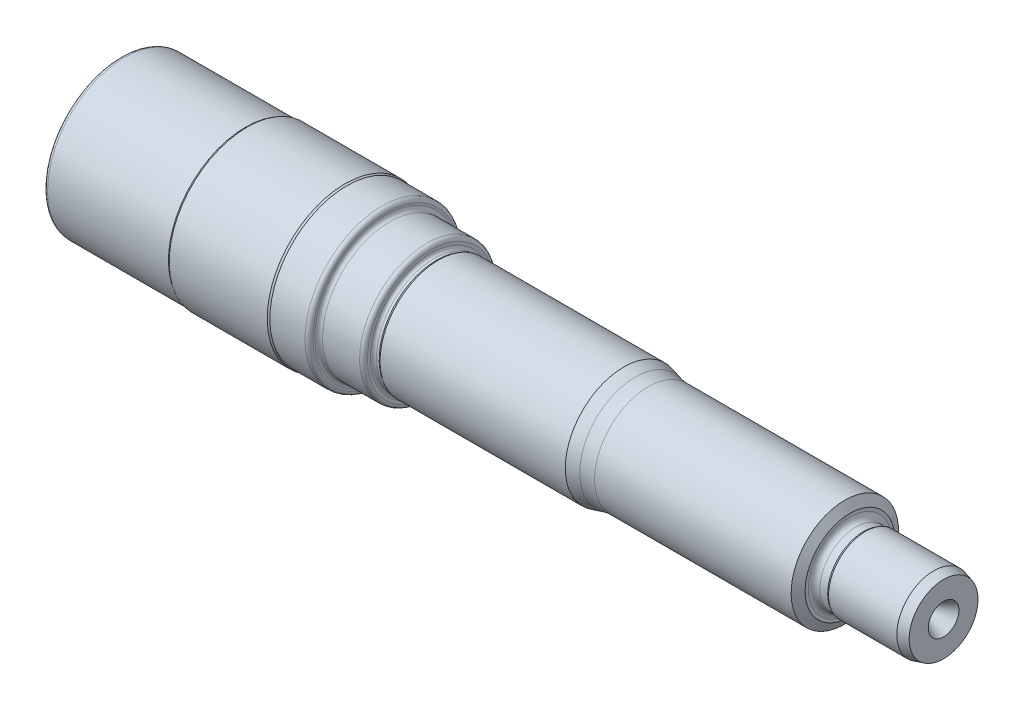
ISO-10303-21;
HEADER;
FILE_DESCRIPTION(('STEP AP214'),'2;1');
FILE_NAME('part.step','',(''),(''),'','','');
FILE_SCHEMA(('AUTOMOTIVE_DESIGN { 1 0 10303 214 1 1 1 1 }'));
ENDSEC;
DATA;
#1=APPLICATION_CONTEXT('core data for automotive mechanical design processes');
#2=APPLICATION_PROTOCOL_DEFINITION('international standard','automotive_design',2000,#1);
#3=PRODUCT_CONTEXT('',#1,'mechanical');
#4=PRODUCT('Part','Part','',(#3));
#5=PRODUCT_RELATED_PRODUCT_CATEGORY('part','',(#4));
#6=PRODUCT_DEFINITION_FORMATION('','',#4);
#7=PRODUCT_DEFINITION_CONTEXT('part definition',#1,'design');
#8=PRODUCT_DEFINITION('design','',#6,#7);
#9=PRODUCT_DEFINITION_SHAPE('','',#8);
#10=(LENGTH_UNIT() NAMED_UNIT(*) SI_UNIT(.MILLI.,.METRE.));
#11=(NAMED_UNIT(*) PLANE_ANGLE_UNIT() SI_UNIT($,.RADIAN.));
#12=(NAMED_UNIT(*) SI_UNIT($,.STERADIAN.) SOLID_ANGLE_UNIT());
#13=UNCERTAINTY_MEASURE_WITH_UNIT(LENGTH_MEASURE(1.E-05),#10,'distance_accuracy_value','');
#14=(GEOMETRIC_REPRESENTATION_CONTEXT(3) GLOBAL_UNCERTAINTY_ASSIGNED_CONTEXT((#13)) GLOBAL_UNIT_ASSIGNED_CONTEXT((#10,
#11,#12)) REPRESENTATION_CONTEXT('',''));
#15=CARTESIAN_POINT('',(0.,0.,0.));
#16=DIRECTION('',(0.,0.,1.));
#17=DIRECTION('',(1.,0.,0.));
#18=AXIS2_PLACEMENT_3D('',#15,#16,#17);
#19=CARTESIAN_POINT('',(32.4330127018922,0.,0.));
#20=DIRECTION('',(1.,0.,0.));
#21=DIRECTION('',(0.,1.,0.));
#22=AXIS2_PLACEMENT_3D('',#19,#20,#21);
#23=CONICAL_SURFACE('',#22,20.,0.523598775598297);
#24=CARTESIAN_POINT('',(32.,0.,0.));
#25=DIRECTION('',(1.,0.,0.));
#26=DIRECTION('',(0.,1.,0.));
#27=AXIS2_PLACEMENT_3D('',#24,#25,#26);
#28=CIRCLE('',#27,19.75);
#29=CARTESIAN_POINT('',(32.,19.75,0.));
#30=VERTEX_POINT('',#29);
#31=EDGE_CURVE('E13',#30,#30,#28,.T.);
#32=ORIENTED_EDGE('',*,*,#31,.T.);
#33=EDGE_LOOP('',(#32));
#34=FACE_BOUND('',#33,.T.);
#35=CARTESIAN_POINT('',(32.4330127018922,0.,0.));
#36=DIRECTION('',(1.,0.,0.));
#37=DIRECTION('',(0.,1.,0.));
#38=AXIS2_PLACEMENT_3D('',#35,#36,#37);
#39=CIRCLE('',#38,20.);
#40=CARTESIAN_POINT('',(32.4330127018922,20.,0.));
#41=VERTEX_POINT('',#40);
#42=EDGE_CURVE('E88',#41,#41,#39,.T.);
#43=ORIENTED_EDGE('',*,*,#42,.F.);
#44=EDGE_LOOP('',(#43));
#45=FACE_BOUND('',#44,.T.);
#46=ADVANCED_FACE('F49',(#34,#45),#23,.T.);
#47=CARTESIAN_POINT('',(204.,0.,0.));
#48=DIRECTION('',(1.,0.,0.));
#49=DIRECTION('',(0.,1.,0.));
#50=AXIS2_PLACEMENT_3D('',#47,#48,#49);
#51=CYLINDRICAL_SURFACE('',#50,19.75);
#52=CARTESIAN_POINT('',(1.,0.,0.));
#53=DIRECTION('',(1.,0.,0.));
#54=DIRECTION('',(0.,1.,0.));
#55=AXIS2_PLACEMENT_3D('',#52,#53,#54);
#56=CIRCLE('',#55,19.75);
#57=CARTESIAN_POINT('',(0.999999999999999,19.75,0.));
#58=VERTEX_POINT('',#57);
#59=EDGE_CURVE('E55',#58,#58,#56,.T.);
#60=ORIENTED_EDGE('',*,*,#59,.T.);
#61=EDGE_LOOP('',(#60));
#62=FACE_BOUND('',#61,.T.);
#63=ORIENTED_EDGE('',*,*,#31,.F.);
#64=EDGE_LOOP('',(#63));
#65=FACE_BOUND('',#64,.T.);
#66=ADVANCED_FACE('F76',(#62,#65),#51,.T.);
#67=CARTESIAN_POINT('',(1.,0.,0.));
#68=DIRECTION('',(1.,0.,0.));
#69=DIRECTION('',(0.,1.,0.));
#70=AXIS2_PLACEMENT_3D('',#67,#68,#69);
#71=TOROIDAL_SURFACE('',#70,18.75,1.);
#72=CARTESIAN_POINT('',(0.,0.,0.));
#73=DIRECTION('',(1.,0.,0.));
#74=DIRECTION('',(0.,1.,0.));
#75=AXIS2_PLACEMENT_3D('',#72,#73,#74);
#76=CIRCLE('',#75,18.75);
#77=CARTESIAN_POINT('',(0.,18.75,0.));
#78=VERTEX_POINT('',#77);
#79=EDGE_CURVE('E193',#78,#78,#76,.T.);
#80=ORIENTED_EDGE('',*,*,#79,.T.);
#81=EDGE_LOOP('',(#80));
#82=FACE_BOUND('',#81,.T.);
#83=ORIENTED_EDGE('',*,*,#59,.F.);
#84=EDGE_LOOP('',(#83));
#85=FACE_BOUND('',#84,.T.);
#86=ADVANCED_FACE('F82',(#82,#85),#71,.T.);
#87=CARTESIAN_POINT('',(0.,15.8660254037844,0.));
#88=DIRECTION('',(-1.,0.,0.));
#89=DIRECTION('',(0.,-1.,0.));
#90=AXIS2_PLACEMENT_3D('',#87,#88,#89);
#91=PLANE('',#90);
#92=CARTESIAN_POINT('',(0.,0.,0.));
#93=DIRECTION('',(1.,0.,0.));
#94=DIRECTION('',(0.,1.,0.));
#95=AXIS2_PLACEMENT_3D('',#92,#93,#94);
#96=CIRCLE('',#95,15.8660254037844);
#97=CARTESIAN_POINT('',(0.,15.8660254037844,0.));
#98=VERTEX_POINT('',#97);
#99=EDGE_CURVE('E190',#98,#98,#96,.T.);
#100=ORIENTED_EDGE('',*,*,#99,.T.);
#101=EDGE_LOOP('',(#100));
#102=FACE_BOUND('',#101,.T.);
#103=ORIENTED_EDGE('',*,*,#79,.F.);
#104=EDGE_LOOP('',(#103));
#105=FACE_BOUND('',#104,.T.);
#106=ADVANCED_FACE('F200',(#102,#105),#91,.T.);
#107=CARTESIAN_POINT('',(0.,0.,0.));
#108=DIRECTION('',(-1.,0.,0.));
#109=DIRECTION('',(0.,-1.,0.));
#110=AXIS2_PLACEMENT_3D('',#107,#108,#109);
#111=CONICAL_SURFACE('',#110,15.8660254037844,0.52359877559829);
#112=CARTESIAN_POINT('',(1.5,0.,0.));
#113=DIRECTION('',(1.,0.,0.));
#114=DIRECTION('',(0.,1.,0.));
#115=AXIS2_PLACEMENT_3D('',#112,#113,#114);
#116=CIRCLE('',#115,15.);
#117=CARTESIAN_POINT('',(1.5,15.,0.));
#118=VERTEX_POINT('',#117);
#119=EDGE_CURVE('E187',#118,#118,#116,.T.);
#120=ORIENTED_EDGE('',*,*,#119,.T.);
#121=EDGE_LOOP('',(#120));
#122=FACE_BOUND('',#121,.T.);
#123=ORIENTED_EDGE('',*,*,#99,.F.);
#124=EDGE_LOOP('',(#123));
#125=FACE_BOUND('',#124,.T.);
#126=ADVANCED_FACE('F206',(#122,#125),#111,.F.);
#127=CARTESIAN_POINT('',(204.,0.,0.));
#128=DIRECTION('',(1.,0.,0.));
#129=DIRECTION('',(0.,1.,0.));
#130=AXIS2_PLACEMENT_3D('',#127,#128,#129);
#131=CYLINDRICAL_SURFACE('',#130,15.);
#132=CARTESIAN_POINT('',(4.,0.,0.));
#133=DIRECTION('',(1.,0.,0.));
#134=DIRECTION('',(0.,1.,0.));
#135=AXIS2_PLACEMENT_3D('',#132,#133,#134);
#136=CIRCLE('',#135,15.);
#137=CARTESIAN_POINT('',(4.,15.,0.));
#138=VERTEX_POINT('',#137);
#139=EDGE_CURVE('E184',#138,#138,#136,.T.);
#140=ORIENTED_EDGE('',*,*,#139,.T.);
#141=EDGE_LOOP('',(#140));
#142=FACE_BOUND('',#141,.T.);
#143=ORIENTED_EDGE('',*,*,#119,.F.);
#144=EDGE_LOOP('',(#143));
#145=FACE_BOUND('',#144,.T.);
#146=ADVANCED_FACE('F212',(#142,#145),#131,.F.);
#147=CARTESIAN_POINT('',(4.,0.,0.));
#148=DIRECTION('',(-1.,0.,0.));
#149=DIRECTION('',(0.,-1.,0.));
#150=AXIS2_PLACEMENT_3D('',#147,#148,#149);
#151=CONICAL_SURFACE('',#150,15.,0.78539816339745);
#152=CARTESIAN_POINT('',(7.19999999999998,0.,0.));
#153=DIRECTION('',(1.,0.,0.));
#154=DIRECTION('',(0.,1.,0.));
#155=AXIS2_PLACEMENT_3D('',#152,#153,#154);
#156=CIRCLE('',#155,11.8);
#157=CARTESIAN_POINT('',(7.19999999999998,11.8,0.));
#158=VERTEX_POINT('',#157);
#159=EDGE_CURVE('E181',#158,#158,#156,.T.);
#160=ORIENTED_EDGE('',*,*,#159,.T.);
#161=EDGE_LOOP('',(#160));
#162=FACE_BOUND('',#161,.T.);
#163=ORIENTED_EDGE('',*,*,#139,.F.);
#164=EDGE_LOOP('',(#163));
#165=FACE_BOUND('',#164,.T.);
#166=ADVANCED_FACE('F216',(#162,#165),#151,.F.);
#167=CARTESIAN_POINT('',(204.,0.,0.));
#168=DIRECTION('',(1.,0.,0.));
#169=DIRECTION('',(0.,1.,0.));
#170=AXIS2_PLACEMENT_3D('',#167,#168,#169);
#171=CYLINDRICAL_SURFACE('',#170,11.8);
#172=CARTESIAN_POINT('',(50.,0.,0.));
#173=DIRECTION('',(1.,0.,0.));
#174=DIRECTION('',(0.,1.,0.));
#175=AXIS2_PLACEMENT_3D('',#172,#173,#174);
#176=CIRCLE('',#175,11.8);
#177=CARTESIAN_POINT('',(50.,11.8,0.));
#178=VERTEX_POINT('',#177);
#179=EDGE_CURVE('E178',#178,#178,#176,.T.);
#180=ORIENTED_EDGE('',*,*,#179,.T.);
#181=EDGE_LOOP('',(#180));
#182=FACE_BOUND('',#181,.T.);
#183=ORIENTED_EDGE('',*,*,#159,.F.);
#184=EDGE_LOOP('',(#183));
#185=FACE_BOUND('',#184,.T.);
#186=ADVANCED_FACE('F220',(#182,#185),#171,.F.);
#187=CARTESIAN_POINT('',(50.,0.,0.));
#188=DIRECTION('',(1.,0.,0.));
#189=DIRECTION('',(0.,1.,0.));
#190=AXIS2_PLACEMENT_3D('',#187,#188,#189);
#191=CONICAL_SURFACE('',#190,11.8,0.47123889803847);
#192=CARTESIAN_POINT('',(55.2990483648639,0.,0.));
#193=DIRECTION('',(1.,0.,0.));
#194=DIRECTION('',(0.,1.,0.));
#195=AXIS2_PLACEMENT_3D('',#192,#193,#194);
#196=CIRCLE('',#195,14.5);
#197=CARTESIAN_POINT('',(55.2990483648639,14.5,0.));
#198=VERTEX_POINT('',#197);
#199=EDGE_CURVE('E175',#198,#198,#196,.T.);
#200=ORIENTED_EDGE('',*,*,#199,.T.);
#201=EDGE_LOOP('',(#200));
#202=FACE_BOUND('',#201,.T.);
#203=ORIENTED_EDGE('',*,*,#179,.F.);
#204=EDGE_LOOP('',(#203));
#205=FACE_BOUND('',#204,.T.);
#206=ADVANCED_FACE('F224',(#202,#205),#191,.F.);
#207=CARTESIAN_POINT('',(204.,0.,0.));
#208=DIRECTION('',(1.,0.,0.));
#209=DIRECTION('',(0.,1.,0.));
#210=AXIS2_PLACEMENT_3D('',#207,#208,#209);
#211=CYLINDRICAL_SURFACE('',#210,14.5);
#212=CARTESIAN_POINT('',(61.,0.,0.));
#213=DIRECTION('',(1.,0.,0.));
#214=DIRECTION('',(0.,1.,0.));
#215=AXIS2_PLACEMENT_3D('',#212,#213,#214);
#216=CIRCLE('',#215,14.5);
#217=CARTESIAN_POINT('',(61.,14.5,0.));
#218=VERTEX_POINT('',#217);
#219=EDGE_CURVE('E172',#218,#218,#216,.T.);
#220=ORIENTED_EDGE('',*,*,#219,.T.);
#221=EDGE_LOOP('',(#220));
#222=FACE_BOUND('',#221,.T.);
#223=ORIENTED_EDGE('',*,*,#199,.F.);
#224=EDGE_LOOP('',(#223));
#225=FACE_BOUND('',#224,.T.);
#226=ADVANCED_FACE('F228',(#222,#225),#211,.F.);
#227=CARTESIAN_POINT('',(61.,0.,0.));
#228=DIRECTION('',(1.,0.,0.));
#229=DIRECTION('',(0.,1.,0.));
#230=AXIS2_PLACEMENT_3D('',#227,#228,#229);
#231=TOROIDAL_SURFACE('',#230,12.5,2.);
#232=CARTESIAN_POINT('',(63.,0.,0.));
#233=DIRECTION('',(1.,0.,0.));
#234=DIRECTION('',(0.,1.,0.));
#235=AXIS2_PLACEMENT_3D('',#232,#233,#234);
#236=CIRCLE('',#235,12.5);
#237=CARTESIAN_POINT('',(63.,12.5,0.));
#238=VERTEX_POINT('',#237);
#239=EDGE_CURVE('E169',#238,#238,#236,.T.);
#240=ORIENTED_EDGE('',*,*,#239,.T.);
#241=EDGE_LOOP('',(#240));
#242=FACE_BOUND('',#241,.T.);
#243=ORIENTED_EDGE('',*,*,#219,.F.);
#244=EDGE_LOOP('',(#243));
#245=FACE_BOUND('',#244,.T.);
#246=ADVANCED_FACE('F71',(#242,#245),#231,.F.);
#247=CARTESIAN_POINT('',(63.,0.,0.));
#248=DIRECTION('',(-1.,0.,0.));
#249=DIRECTION('',(0.,-1.,0.));
#250=AXIS2_PLACEMENT_3D('',#247,#248,#249);
#251=PLANE('',#250);
#252=ORIENTED_EDGE('',*,*,#239,.F.);
#253=EDGE_LOOP('',(#252));
#254=FACE_BOUND('',#253,.T.);
#255=ADVANCED_FACE('F61',(#254),#251,.T.);
#256=CARTESIAN_POINT('',(204.,0.,0.));
#257=DIRECTION('',(1.,0.,0.));
#258=DIRECTION('',(0.,1.,0.));
#259=AXIS2_PLACEMENT_3D('',#256,#257,#258);
#260=CONICAL_SURFACE('',#259,0.,1.04719755119659);
#261=CARTESIAN_POINT('',(204.909326673974,0.,0.));
#262=DIRECTION('',(1.,0.,0.));
#263=DIRECTION('',(0.,1.,0.));
#264=AXIS2_PLACEMENT_3D('',#261,#262,#263);
#265=CIRCLE('',#264,1.575);
#266=CARTESIAN_POINT('',(204.909326673974,1.575,0.));
#267=VERTEX_POINT('',#266);
#268=EDGE_CURVE('E167',#267,#267,#265,.T.);
#269=ORIENTED_EDGE('',*,*,#268,.T.);
#270=EDGE_LOOP('',(#269));
#271=FACE_BOUND('',#270,.T.);
#272=CARTESIAN_POINT('',(204.,0.,0.));
#273=VERTEX_POINT('',#272);
#274=VERTEX_LOOP('',#273);
#275=FACE_BOUND('',#274,.T.);
#276=ADVANCED_FACE('F58',(#271,#275),#260,.F.);
#277=CARTESIAN_POINT('',(204.,0.,0.));
#278=DIRECTION('',(1.,0.,0.));
#279=DIRECTION('',(0.,1.,0.));
#280=AXIS2_PLACEMENT_3D('',#277,#278,#279);
#281=CYLINDRICAL_SURFACE('',#280,1.575);
#282=CARTESIAN_POINT('',(206.909326673974,0.,0.));
#283=DIRECTION('',(1.,0.,0.));
#284=DIRECTION('',(0.,1.,0.));
#285=AXIS2_PLACEMENT_3D('',#282,#283,#284);
#286=CIRCLE('',#285,1.575);
#287=CARTESIAN_POINT('',(206.909326673974,1.575,0.));
#288=VERTEX_POINT('',#287);
#289=EDGE_CURVE('E164',#288,#288,#286,.T.);
#290=ORIENTED_EDGE('',*,*,#289,.T.);
#291=EDGE_LOOP('',(#290));
#292=FACE_BOUND('',#291,.T.);
#293=ORIENTED_EDGE('',*,*,#268,.F.);
#294=EDGE_LOOP('',(#293));
#295=FACE_BOUND('',#294,.T.);
#296=ADVANCED_FACE('F60',(#292,#295),#281,.F.);
#297=CARTESIAN_POINT('',(206.909326673974,0.,0.));
#298=DIRECTION('',(1.,0.,0.));
#299=DIRECTION('',(0.,1.,0.));
#300=AXIS2_PLACEMENT_3D('',#297,#298,#299);
#301=CONICAL_SURFACE('',#300,1.575,0.523598775598298);
#302=CARTESIAN_POINT('',(211.,0.,0.));
#303=DIRECTION('',(1.,0.,0.));
#304=DIRECTION('',(0.,1.,0.));
#305=AXIS2_PLACEMENT_3D('',#302,#303,#304);
#306=CIRCLE('',#305,3.93675134594813);
#307=CARTESIAN_POINT('',(211.,3.93675134594812,0.));
#308=VERTEX_POINT('',#307);
#309=EDGE_CURVE('E161',#308,#308,#306,.T.);
#310=ORIENTED_EDGE('',*,*,#309,.T.);
#311=EDGE_LOOP('',(#310));
#312=FACE_BOUND('',#311,.T.);
#313=ORIENTED_EDGE('',*,*,#289,.F.);
#314=EDGE_LOOP('',(#313));
#315=FACE_BOUND('',#314,.T.);
#316=ADVANCED_FACE('F68',(#312,#315),#301,.F.);
#317=CARTESIAN_POINT('',(211.,8.83012701892219,0.));
#318=DIRECTION('',(1.,0.,0.));
#319=DIRECTION('',(0.,1.,0.));
#320=AXIS2_PLACEMENT_3D('',#317,#318,#319);
#321=PLANE('',#320);
#322=CARTESIAN_POINT('',(211.,0.,0.));
#323=DIRECTION('',(1.,0.,0.));
#324=DIRECTION('',(0.,1.,0.));
#325=AXIS2_PLACEMENT_3D('',#322,#323,#324);
#326=CIRCLE('',#325,8.83012701892219);
#327=CARTESIAN_POINT('',(211.,8.83012701892219,0.));
#328=VERTEX_POINT('',#327);
#329=EDGE_CURVE('E158',#328,#328,#326,.T.);
#330=ORIENTED_EDGE('',*,*,#329,.T.);
#331=EDGE_LOOP('',(#330));
#332=FACE_BOUND('',#331,.T.);
#333=ORIENTED_EDGE('',*,*,#309,.F.);
#334=EDGE_LOOP('',(#333));
#335=FACE_BOUND('',#334,.T.);
#336=ADVANCED_FACE('F280',(#332,#335),#321,.T.);
#337=CARTESIAN_POINT('',(211.,0.,0.));
#338=DIRECTION('',(-1.,0.,0.));
#339=DIRECTION('',(0.,-1.,0.));
#340=AXIS2_PLACEMENT_3D('',#337,#338,#339);
#341=CONICAL_SURFACE('',#340,8.83012701892219,0.26179938779915);
#342=CARTESIAN_POINT('',(208.5,0.,0.));
#343=DIRECTION('',(1.,0.,0.));
#344=DIRECTION('',(0.,1.,0.));
#345=AXIS2_PLACEMENT_3D('',#342,#343,#344);
#346=CIRCLE('',#345,9.5);
#347=CARTESIAN_POINT('',(208.5,9.49999999999999,0.));
#348=VERTEX_POINT('',#347);
#349=EDGE_CURVE('E155',#348,#348,#346,.T.);
#350=ORIENTED_EDGE('',*,*,#349,.T.);
#351=EDGE_LOOP('',(#350));
#352=FACE_BOUND('',#351,.T.);
#353=ORIENTED_EDGE('',*,*,#329,.F.);
#354=EDGE_LOOP('',(#353));
#355=FACE_BOUND('',#354,.T.);
#356=ADVANCED_FACE('F291',(#352,#355),#341,.T.);
#357=CARTESIAN_POINT('',(204.,0.,0.));
#358=DIRECTION('',(1.,0.,0.));
#359=DIRECTION('',(0.,1.,0.));
#360=AXIS2_PLACEMENT_3D('',#357,#358,#359);
#361=CYLINDRICAL_SURFACE('',#360,9.5);
#362=CARTESIAN_POINT('',(191.,0.,0.));
#363=DIRECTION('',(1.,0.,0.));
#364=DIRECTION('',(0.,1.,0.));
#365=AXIS2_PLACEMENT_3D('',#362,#363,#364);
#366=CIRCLE('',#365,9.5);
#367=CARTESIAN_POINT('',(191.,9.49999999999999,0.));
#368=VERTEX_POINT('',#367);
#369=EDGE_CURVE('E152',#368,#368,#366,.T.);
#370=ORIENTED_EDGE('',*,*,#369,.T.);
#371=EDGE_LOOP('',(#370));
#372=FACE_BOUND('',#371,.T.);
#373=ORIENTED_EDGE('',*,*,#349,.F.);
#374=EDGE_LOOP('',(#373));
#375=FACE_BOUND('',#374,.T.);
#376=ADVANCED_FACE('F302',(#372,#375),#361,.T.);
#377=CARTESIAN_POINT('',(191.,0.,0.));
#378=DIRECTION('',(1.,0.,0.));
#379=DIRECTION('',(0.,1.,0.));
#380=AXIS2_PLACEMENT_3D('',#377,#378,#379);
#381=CONICAL_SURFACE('',#380,9.5,0.523598775598306);
#382=CARTESIAN_POINT('',(190.480384757729,0.,0.));
#383=DIRECTION('',(1.,0.,0.));
#384=DIRECTION('',(0.,1.,0.));
#385=AXIS2_PLACEMENT_3D('',#382,#383,#384);
#386=CIRCLE('',#385,9.2);
#387=CARTESIAN_POINT('',(190.480384757729,9.2,0.));
#388=VERTEX_POINT('',#387);
#389=EDGE_CURVE('E149',#388,#388,#386,.T.);
#390=ORIENTED_EDGE('',*,*,#389,.T.);
#391=EDGE_LOOP('',(#390));
#392=FACE_BOUND('',#391,.T.);
#393=ORIENTED_EDGE('',*,*,#369,.F.);
#394=EDGE_LOOP('',(#393));
#395=FACE_BOUND('',#394,.T.);
#396=ADVANCED_FACE('F312',(#392,#395),#381,.T.);
#397=CARTESIAN_POINT('',(204.,0.,0.));
#398=DIRECTION('',(1.,0.,0.));
#399=DIRECTION('',(0.,1.,0.));
#400=AXIS2_PLACEMENT_3D('',#397,#398,#399);
#401=CYLINDRICAL_SURFACE('',#400,9.2);
#402=CARTESIAN_POINT('',(188.5,0.,0.));
#403=DIRECTION('',(1.,0.,0.));
#404=DIRECTION('',(0.,1.,0.));
#405=AXIS2_PLACEMENT_3D('',#402,#403,#404);
#406=CIRCLE('',#405,9.2);
#407=CARTESIAN_POINT('',(188.5,9.2,0.));
#408=VERTEX_POINT('',#407);
#409=EDGE_CURVE('E146',#408,#408,#406,.T.);
#410=ORIENTED_EDGE('',*,*,#409,.T.);
#411=EDGE_LOOP('',(#410));
#412=FACE_BOUND('',#411,.T.);
#413=ORIENTED_EDGE('',*,*,#389,.F.);
#414=EDGE_LOOP('',(#413));
#415=FACE_BOUND('',#414,.T.);
#416=ADVANCED_FACE('F322',(#412,#415),#401,.T.);
#417=CARTESIAN_POINT('',(188.5,0.,0.));
#418=DIRECTION('',(1.,0.,0.));
#419=DIRECTION('',(0.,1.,0.));
#420=AXIS2_PLACEMENT_3D('',#417,#418,#419);
#421=TOROIDAL_SURFACE('',#420,10.7,1.5);
#422=CARTESIAN_POINT('',(187.,0.,0.));
#423=DIRECTION('',(1.,0.,0.));
#424=DIRECTION('',(0.,1.,0.));
#425=AXIS2_PLACEMENT_3D('',#422,#423,#424);
#426=CIRCLE('',#425,10.7);
#427=CARTESIAN_POINT('',(187.,10.7,0.));
#428=VERTEX_POINT('',#427);
#429=EDGE_CURVE('E143',#428,#428,#426,.T.);
#430=ORIENTED_EDGE('',*,*,#429,.T.);
#431=EDGE_LOOP('',(#430));
#432=FACE_BOUND('',#431,.T.);
#433=ORIENTED_EDGE('',*,*,#409,.F.);
#434=EDGE_LOOP('',(#433));
#435=FACE_BOUND('',#434,.T.);
#436=ADVANCED_FACE('F333',(#432,#435),#421,.F.);
#437=CARTESIAN_POINT('',(187.,11.5,0.));
#438=DIRECTION('',(1.,0.,0.));
#439=DIRECTION('',(0.,1.,0.));
#440=AXIS2_PLACEMENT_3D('',#437,#438,#439);
#441=PLANE('',#440);
#442=CARTESIAN_POINT('',(187.,0.,0.));
#443=DIRECTION('',(1.,0.,0.));
#444=DIRECTION('',(0.,1.,0.));
#445=AXIS2_PLACEMENT_3D('',#442,#443,#444);
#446=CIRCLE('',#445,11.5);
#447=CARTESIAN_POINT('',(187.,11.5,0.));
#448=VERTEX_POINT('',#447);
#449=EDGE_CURVE('E140',#448,#448,#446,.T.);
#450=ORIENTED_EDGE('',*,*,#449,.T.);
#451=EDGE_LOOP('',(#450));
#452=FACE_BOUND('',#451,.T.);
#453=ORIENTED_EDGE('',*,*,#429,.F.);
#454=EDGE_LOOP('',(#453));
#455=FACE_BOUND('',#454,.T.);
#456=ADVANCED_FACE('F344',(#452,#455),#441,.T.);
#457=CARTESIAN_POINT('',(187.,0.,0.));
#458=DIRECTION('',(-1.,0.,0.));
#459=DIRECTION('',(0.,-1.,0.));
#460=AXIS2_PLACEMENT_3D('',#457,#458,#459);
#461=CONICAL_SURFACE('',#460,11.5,1.04719755119659);
#462=CARTESIAN_POINT('',(185.686528137594,0.,0.));
#463=DIRECTION('',(1.,0.,0.));
#464=DIRECTION('',(0.,1.,0.));
#465=AXIS2_PLACEMENT_3D('',#462,#463,#464);
#466=CIRCLE('',#465,13.775);
#467=CARTESIAN_POINT('',(185.686528137594,13.775,0.));
#468=VERTEX_POINT('',#467);
#469=EDGE_CURVE('E137',#468,#468,#466,.T.);
#470=ORIENTED_EDGE('',*,*,#469,.T.);
#471=EDGE_LOOP('',(#470));
#472=FACE_BOUND('',#471,.T.);
#473=ORIENTED_EDGE('',*,*,#449,.F.);
#474=EDGE_LOOP('',(#473));
#475=FACE_BOUND('',#474,.T.);
#476=ADVANCED_FACE('F355',(#472,#475),#461,.T.);
#477=CARTESIAN_POINT('',(204.,0.,0.));
#478=DIRECTION('',(1.,0.,0.));
#479=DIRECTION('',(0.,1.,0.));
#480=AXIS2_PLACEMENT_3D('',#477,#478,#479);
#481=CYLINDRICAL_SURFACE('',#480,13.775);
#482=CARTESIAN_POINT('',(135.283244707908,0.,0.));
#483=DIRECTION('',(1.,0.,0.));
#484=DIRECTION('',(0.,1.,0.));
#485=AXIS2_PLACEMENT_3D('',#482,#483,#484);
#486=CIRCLE('',#485,13.775);
#487=CARTESIAN_POINT('',(135.283244707908,13.775,0.));
#488=VERTEX_POINT('',#487);
#489=EDGE_CURVE('E134',#488,#488,#486,.T.);
#490=ORIENTED_EDGE('',*,*,#489,.T.);
#491=EDGE_LOOP('',(#490));
#492=FACE_BOUND('',#491,.T.);
#493=ORIENTED_EDGE('',*,*,#469,.F.);
#494=EDGE_LOOP('',(#493));
#495=FACE_BOUND('',#494,.T.);
#496=ADVANCED_FACE('F366',(#492,#495),#481,.T.);
#497=CARTESIAN_POINT('',(135.283244707908,0.,0.));
#498=DIRECTION('',(1.,0.,0.));
#499=DIRECTION('',(0.,1.,0.));
#500=AXIS2_PLACEMENT_3D('',#497,#498,#499);
#501=TOROIDAL_SURFACE('',#500,26.775,13.);
#502=CARTESIAN_POINT('',(131.918597121575,0.,0.));
#503=DIRECTION('',(1.,0.,0.));
#504=DIRECTION('',(0.,1.,0.));
#505=AXIS2_PLACEMENT_3D('',#502,#503,#504);
#506=CIRCLE('',#505,14.2179642582421);
#507=CARTESIAN_POINT('',(131.918597121575,14.2179642582421,0.));
#508=VERTEX_POINT('',#507);
#509=EDGE_CURVE('E131',#508,#508,#506,.T.);
#510=ORIENTED_EDGE('',*,*,#509,.T.);
#511=EDGE_LOOP('',(#510));
#512=FACE_BOUND('',#511,.T.);
#513=ORIENTED_EDGE('',*,*,#489,.F.);
#514=EDGE_LOOP('',(#513));
#515=FACE_BOUND('',#514,.T.);
#516=ADVANCED_FACE('F377',(#512,#515),#501,.F.);
#517=CARTESIAN_POINT('',(131.918597121575,0.,0.));
#518=DIRECTION('',(-1.,0.,0.));
#519=DIRECTION('',(0.,-1.,0.));
#520=AXIS2_PLACEMENT_3D('',#517,#518,#519);
#521=CONICAL_SURFACE('',#520,14.2179642582421,0.261799387799143);
#522=CARTESIAN_POINT('',(129.,0.,0.));
#523=DIRECTION('',(1.,0.,0.));
#524=DIRECTION('',(0.,1.,0.));
#525=AXIS2_PLACEMENT_3D('',#522,#523,#524);
#526=CIRCLE('',#525,15.);
#527=CARTESIAN_POINT('',(129.,15.,0.));
#528=VERTEX_POINT('',#527);
#529=EDGE_CURVE('E128',#528,#528,#526,.T.);
#530=ORIENTED_EDGE('',*,*,#529,.T.);
#531=EDGE_LOOP('',(#530));
#532=FACE_BOUND('',#531,.T.);
#533=ORIENTED_EDGE('',*,*,#509,.F.);
#534=EDGE_LOOP('',(#533));
#535=FACE_BOUND('',#534,.T.);
#536=ADVANCED_FACE('F388',(#532,#535),#521,.T.);
#537=CARTESIAN_POINT('',(204.,0.,0.));
#538=DIRECTION('',(1.,0.,0.));
#539=DIRECTION('',(0.,1.,0.));
#540=AXIS2_PLACEMENT_3D('',#537,#538,#539);
#541=CYLINDRICAL_SURFACE('',#540,15.);
#542=CARTESIAN_POINT('',(81.5,0.,0.));
#543=DIRECTION('',(1.,0.,0.));
#544=DIRECTION('',(0.,1.,0.));
#545=AXIS2_PLACEMENT_3D('',#542,#543,#544);
#546=CIRCLE('',#545,15.);
#547=CARTESIAN_POINT('',(81.5,15.,0.));
#548=VERTEX_POINT('',#547);
#549=EDGE_CURVE('E125',#548,#548,#546,.T.);
#550=ORIENTED_EDGE('',*,*,#549,.T.);
#551=EDGE_LOOP('',(#550));
#552=FACE_BOUND('',#551,.T.);
#553=ORIENTED_EDGE('',*,*,#529,.F.);
#554=EDGE_LOOP('',(#553));
#555=FACE_BOUND('',#554,.T.);
#556=ADVANCED_FACE('F398',(#552,#555),#541,.T.);
#557=CARTESIAN_POINT('',(81.5,0.,0.));
#558=DIRECTION('',(1.,0.,0.));
#559=DIRECTION('',(0.,1.,0.));
#560=AXIS2_PLACEMENT_3D('',#557,#558,#559);
#561=CONICAL_SURFACE('',#560,15.,0.523598775598301);
#562=CARTESIAN_POINT('',(80.9803847577293,0.,0.));
#563=DIRECTION('',(1.,0.,0.));
#564=DIRECTION('',(0.,1.,0.));
#565=AXIS2_PLACEMENT_3D('',#562,#563,#564);
#566=CIRCLE('',#565,14.7);
#567=CARTESIAN_POINT('',(80.9803847577293,14.7,0.));
#568=VERTEX_POINT('',#567);
#569=EDGE_CURVE('E122',#568,#568,#566,.T.);
#570=ORIENTED_EDGE('',*,*,#569,.T.);
#571=EDGE_LOOP('',(#570));
#572=FACE_BOUND('',#571,.T.);
#573=ORIENTED_EDGE('',*,*,#549,.F.);
#574=EDGE_LOOP('',(#573));
#575=FACE_BOUND('',#574,.T.);
#576=ADVANCED_FACE('F408',(#572,#575),#561,.T.);
#577=CARTESIAN_POINT('',(204.,0.,0.));
#578=DIRECTION('',(1.,0.,0.));
#579=DIRECTION('',(0.,1.,0.));
#580=AXIS2_PLACEMENT_3D('',#577,#578,#579);
#581=CYLINDRICAL_SURFACE('',#580,14.7);
#582=CARTESIAN_POINT('',(80.3,0.,0.));
#583=DIRECTION('',(1.,0.,0.));
#584=DIRECTION('',(0.,1.,0.));
#585=AXIS2_PLACEMENT_3D('',#582,#583,#584);
#586=CIRCLE('',#585,14.7);
#587=CARTESIAN_POINT('',(80.3,14.7,0.));
#588=VERTEX_POINT('',#587);
#589=EDGE_CURVE('E119',#588,#588,#586,.T.);
#590=ORIENTED_EDGE('',*,*,#589,.T.);
#591=EDGE_LOOP('',(#590));
#592=FACE_BOUND('',#591,.T.);
#593=ORIENTED_EDGE('',*,*,#569,.F.);
#594=EDGE_LOOP('',(#593));
#595=FACE_BOUND('',#594,.T.);
#596=ADVANCED_FACE('F418',(#592,#595),#581,.T.);
#597=CARTESIAN_POINT('',(80.3,0.,0.));
#598=DIRECTION('',(1.,0.,0.));
#599=DIRECTION('',(0.,1.,0.));
#600=AXIS2_PLACEMENT_3D('',#597,#598,#599);
#601=TOROIDAL_SURFACE('',#600,15.5,0.799999999999998);
#602=CARTESIAN_POINT('',(79.5,0.,0.));
#603=DIRECTION('',(1.,0.,0.));
#604=DIRECTION('',(0.,1.,0.));
#605=AXIS2_PLACEMENT_3D('',#602,#603,#604);
#606=CIRCLE('',#605,15.5);
#607=CARTESIAN_POINT('',(79.5,15.5,0.));
#608=VERTEX_POINT('',#607);
#609=EDGE_CURVE('E116',#608,#608,#606,.T.);
#610=ORIENTED_EDGE('',*,*,#609,.T.);
#611=EDGE_LOOP('',(#610));
#612=FACE_BOUND('',#611,.T.);
#613=ORIENTED_EDGE('',*,*,#589,.F.);
#614=EDGE_LOOP('',(#613));
#615=FACE_BOUND('',#614,.T.);
#616=ADVANCED_FACE('F428',(#612,#615),#601,.F.);
#617=CARTESIAN_POINT('',(79.5,16.25,0.));
#618=DIRECTION('',(1.,0.,0.));
#619=DIRECTION('',(0.,1.,0.));
#620=AXIS2_PLACEMENT_3D('',#617,#618,#619);
#621=PLANE('',#620);
#622=CARTESIAN_POINT('',(79.5,0.,0.));
#623=DIRECTION('',(1.,0.,0.));
#624=DIRECTION('',(0.,1.,0.));
#625=AXIS2_PLACEMENT_3D('',#622,#623,#624);
#626=CIRCLE('',#625,16.25);
#627=CARTESIAN_POINT('',(79.5,16.25,0.));
#628=VERTEX_POINT('',#627);
#629=EDGE_CURVE('E113',#628,#628,#626,.T.);
#630=ORIENTED_EDGE('',*,*,#629,.T.);
#631=EDGE_LOOP('',(#630));
#632=FACE_BOUND('',#631,.T.);
#633=ORIENTED_EDGE('',*,*,#609,.F.);
#634=EDGE_LOOP('',(#633));
#635=FACE_BOUND('',#634,.T.);
#636=ADVANCED_FACE('F439',(#632,#635),#621,.T.);
#637=CARTESIAN_POINT('',(78.5,0.,0.));
#638=DIRECTION('',(1.,0.,0.));
#639=DIRECTION('',(0.,1.,0.));
#640=AXIS2_PLACEMENT_3D('',#637,#638,#639);
#641=TOROIDAL_SURFACE('',#640,16.25,1.);
#642=CARTESIAN_POINT('',(78.5,0.,0.));
#643=DIRECTION('',(1.,0.,0.));
#644=DIRECTION('',(0.,1.,0.));
#645=AXIS2_PLACEMENT_3D('',#642,#643,#644);
#646=CIRCLE('',#645,17.25);
#647=CARTESIAN_POINT('',(78.5,17.25,0.));
#648=VERTEX_POINT('',#647);
#649=EDGE_CURVE('E110',#648,#648,#646,.T.);
#650=ORIENTED_EDGE('',*,*,#649,.T.);
#651=EDGE_LOOP('',(#650));
#652=FACE_BOUND('',#651,.T.);
#653=ORIENTED_EDGE('',*,*,#629,.F.);
#654=EDGE_LOOP('',(#653));
#655=FACE_BOUND('',#654,.T.);
#656=ADVANCED_FACE('F450',(#652,#655),#641,.T.);
#657=CARTESIAN_POINT('',(204.,0.,0.));
#658=DIRECTION('',(1.,0.,0.));
#659=DIRECTION('',(0.,1.,0.));
#660=AXIS2_PLACEMENT_3D('',#657,#658,#659);
#661=CYLINDRICAL_SURFACE('',#660,17.25);
#662=CARTESIAN_POINT('',(69.,0.,0.));
#663=DIRECTION('',(1.,0.,0.));
#664=DIRECTION('',(0.,1.,0.));
#665=AXIS2_PLACEMENT_3D('',#662,#663,#664);
#666=CIRCLE('',#665,17.25);
#667=CARTESIAN_POINT('',(69.,17.25,0.));
#668=VERTEX_POINT('',#667);
#669=EDGE_CURVE('E107',#668,#668,#666,.T.);
#670=ORIENTED_EDGE('',*,*,#669,.T.);
#671=EDGE_LOOP('',(#670));
#672=FACE_BOUND('',#671,.T.);
#673=ORIENTED_EDGE('',*,*,#649,.F.);
#674=EDGE_LOOP('',(#673));
#675=FACE_BOUND('',#674,.T.);
#676=ADVANCED_FACE('F461',(#672,#675),#661,.T.);
#677=CARTESIAN_POINT('',(69.,0.,0.));
#678=DIRECTION('',(1.,0.,0.));
#679=DIRECTION('',(0.,1.,0.));
#680=AXIS2_PLACEMENT_3D('',#677,#678,#679);
#681=TOROIDAL_SURFACE('',#680,18.25,1.);
#682=CARTESIAN_POINT('',(68.,0.,0.));
#683=DIRECTION('',(1.,0.,0.));
#684=DIRECTION('',(0.,1.,0.));
#685=AXIS2_PLACEMENT_3D('',#682,#683,#684);
#686=CIRCLE('',#685,18.25);
#687=CARTESIAN_POINT('',(68.,18.25,0.));
#688=VERTEX_POINT('',#687);
#689=EDGE_CURVE('E104',#688,#688,#686,.T.);
#690=ORIENTED_EDGE('',*,*,#689,.T.);
#691=EDGE_LOOP('',(#690));
#692=FACE_BOUND('',#691,.T.);
#693=ORIENTED_EDGE('',*,*,#669,.F.);
#694=EDGE_LOOP('',(#693));
#695=FACE_BOUND('',#694,.T.);
#696=ADVANCED_FACE('F472',(#692,#695),#681,.F.);
#697=CARTESIAN_POINT('',(68.,18.75,0.));
#698=DIRECTION('',(1.,0.,0.));
#699=DIRECTION('',(0.,1.,0.));
#700=AXIS2_PLACEMENT_3D('',#697,#698,#699);
#701=PLANE('',#700);
#702=CARTESIAN_POINT('',(68.,0.,0.));
#703=DIRECTION('',(1.,0.,0.));
#704=DIRECTION('',(0.,1.,0.));
#705=AXIS2_PLACEMENT_3D('',#702,#703,#704);
#706=CIRCLE('',#705,18.75);
#707=CARTESIAN_POINT('',(68.,18.75,0.));
#708=VERTEX_POINT('',#707);
#709=EDGE_CURVE('E101',#708,#708,#706,.T.);
#710=ORIENTED_EDGE('',*,*,#709,.T.);
#711=EDGE_LOOP('',(#710));
#712=FACE_BOUND('',#711,.T.);
#713=ORIENTED_EDGE('',*,*,#689,.F.);
#714=EDGE_LOOP('',(#713));
#715=FACE_BOUND('',#714,.T.);
#716=ADVANCED_FACE('F483',(#712,#715),#701,.T.);
#717=CARTESIAN_POINT('',(67.,0.,0.));
#718=DIRECTION('',(1.,0.,0.));
#719=DIRECTION('',(0.,1.,0.));
#720=AXIS2_PLACEMENT_3D('',#717,#718,#719);
#721=TOROIDAL_SURFACE('',#720,18.75,1.);
#722=CARTESIAN_POINT('',(67.,0.,0.));
#723=DIRECTION('',(1.,0.,0.));
#724=DIRECTION('',(0.,1.,0.));
#725=AXIS2_PLACEMENT_3D('',#722,#723,#724);
#726=CIRCLE('',#725,19.75);
#727=CARTESIAN_POINT('',(67.,19.75,0.));
#728=VERTEX_POINT('',#727);
#729=EDGE_CURVE('E98',#728,#728,#726,.T.);
#730=ORIENTED_EDGE('',*,*,#729,.T.);
#731=EDGE_LOOP('',(#730));
#732=FACE_BOUND('',#731,.T.);
#733=ORIENTED_EDGE('',*,*,#709,.F.);
#734=EDGE_LOOP('',(#733));
#735=FACE_BOUND('',#734,.T.);
#736=ADVANCED_FACE('F494',(#732,#735),#721,.T.);
#737=CARTESIAN_POINT('',(204.,0.,0.));
#738=DIRECTION('',(1.,0.,0.));
#739=DIRECTION('',(0.,1.,0.));
#740=AXIS2_PLACEMENT_3D('',#737,#738,#739);
#741=CYLINDRICAL_SURFACE('',#740,19.75);
#742=CARTESIAN_POINT('',(58.,0.,0.));
#743=DIRECTION('',(1.,0.,0.));
#744=DIRECTION('',(0.,1.,0.));
#745=AXIS2_PLACEMENT_3D('',#742,#743,#744);
#746=CIRCLE('',#745,19.75);
#747=CARTESIAN_POINT('',(58.,19.75,0.));
#748=VERTEX_POINT('',#747);
#749=EDGE_CURVE('E93',#748,#748,#746,.T.);
#750=ORIENTED_EDGE('',*,*,#749,.T.);
#751=EDGE_LOOP('',(#750));
#752=FACE_BOUND('',#751,.T.);
#753=ORIENTED_EDGE('',*,*,#729,.F.);
#754=EDGE_LOOP('',(#753));
#755=FACE_BOUND('',#754,.T.);
#756=ADVANCED_FACE('F505',(#752,#755),#741,.T.);
#757=CARTESIAN_POINT('',(58.,0.,0.));
#758=DIRECTION('',(-1.,0.,0.));
#759=DIRECTION('',(0.,-1.,0.));
#760=AXIS2_PLACEMENT_3D('',#757,#758,#759);
#761=CONICAL_SURFACE('',#760,19.75,0.523598775598297);
#762=CARTESIAN_POINT('',(57.5669872981078,0.,0.));
#763=DIRECTION('',(1.,0.,0.));
#764=DIRECTION('',(0.,1.,0.));
#765=AXIS2_PLACEMENT_3D('',#762,#763,#764);
#766=CIRCLE('',#765,20.);
#767=CARTESIAN_POINT('',(57.5669872981078,20.,0.));
#768=VERTEX_POINT('',#767);
#769=EDGE_CURVE('E90',#768,#768,#766,.T.);
#770=ORIENTED_EDGE('',*,*,#769,.T.);
#771=EDGE_LOOP('',(#770));
#772=FACE_BOUND('',#771,.T.);
#773=ORIENTED_EDGE('',*,*,#749,.F.);
#774=EDGE_LOOP('',(#773));
#775=FACE_BOUND('',#774,.T.);
#776=ADVANCED_FACE('F516',(#772,#775),#761,.T.);
#777=CARTESIAN_POINT('',(204.,0.,0.));
#778=DIRECTION('',(1.,0.,0.));
#779=DIRECTION('',(0.,1.,0.));
#780=AXIS2_PLACEMENT_3D('',#777,#778,#779);
#781=CYLINDRICAL_SURFACE('',#780,20.);
#782=ORIENTED_EDGE('',*,*,#42,.T.);
#783=EDGE_LOOP('',(#782));
#784=FACE_BOUND('',#783,.T.);
#785=ORIENTED_EDGE('',*,*,#769,.F.);
#786=EDGE_LOOP('',(#785));
#787=FACE_BOUND('',#786,.T.);
#788=ADVANCED_FACE('F526',(#784,#787),#781,.T.);
#789=CLOSED_SHELL('',(#46,#66,#86,#106,#126,#146,#166,#186,#206,#226,#246,#255,#276,#296,#316,
#336,#356,#376,#396,#416,#436,#456,#476,#496,#516,#536,#556,#576,#596,#616,#636,#656,#676,#696,
#716,#736,#756,#776,#788));
#790=MANIFOLD_SOLID_BREP('B2',#789);
#791=ADVANCED_BREP_SHAPE_REPRESENTATION('',(#18,#790),#14);
#792=SHAPE_DEFINITION_REPRESENTATION(#9,#791);
ENDSEC;
END-ISO-10303-21;
